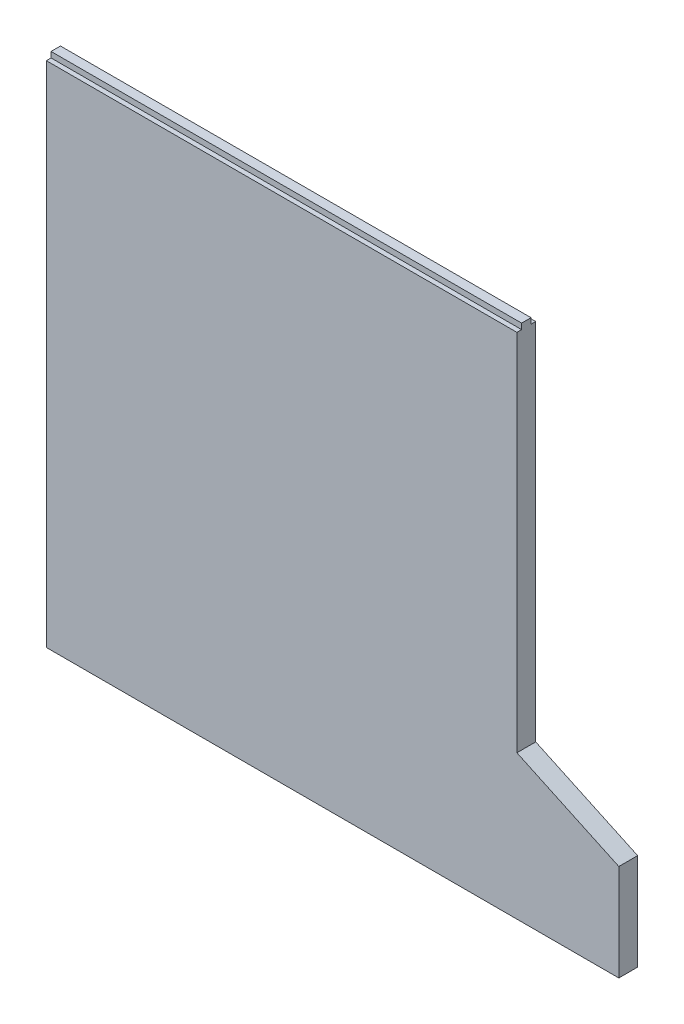
ISO-10303-21;
HEADER;
FILE_DESCRIPTION(('STEP AP214'),'2;1');
FILE_NAME('part.step','',(''),(''),'','','');
FILE_SCHEMA(('AUTOMOTIVE_DESIGN { 1 0 10303 214 1 1 1 1 }'));
ENDSEC;
DATA;
#1=APPLICATION_CONTEXT('core data for automotive mechanical design processes');
#2=APPLICATION_PROTOCOL_DEFINITION('international standard','automotive_design',2000,#1);
#3=PRODUCT_CONTEXT('',#1,'mechanical');
#4=PRODUCT('Part','Part','',(#3));
#5=PRODUCT_RELATED_PRODUCT_CATEGORY('part','',(#4));
#6=PRODUCT_DEFINITION_FORMATION('','',#4);
#7=PRODUCT_DEFINITION_CONTEXT('part definition',#1,'design');
#8=PRODUCT_DEFINITION('design','',#6,#7);
#9=PRODUCT_DEFINITION_SHAPE('','',#8);
#10=(LENGTH_UNIT() NAMED_UNIT(*) SI_UNIT(.MILLI.,.METRE.));
#11=(NAMED_UNIT(*) PLANE_ANGLE_UNIT() SI_UNIT($,.RADIAN.));
#12=(NAMED_UNIT(*) SI_UNIT($,.STERADIAN.) SOLID_ANGLE_UNIT());
#13=UNCERTAINTY_MEASURE_WITH_UNIT(LENGTH_MEASURE(1.E-05),#10,'distance_accuracy_value','');
#14=(GEOMETRIC_REPRESENTATION_CONTEXT(3) GLOBAL_UNCERTAINTY_ASSIGNED_CONTEXT((#13)) GLOBAL_UNIT_ASSIGNED_CONTEXT((#10,
#11,#12)) REPRESENTATION_CONTEXT('',''));
#15=CARTESIAN_POINT('',(0.,0.,0.));
#16=DIRECTION('',(0.,0.,1.));
#17=DIRECTION('',(1.,0.,0.));
#18=AXIS2_PLACEMENT_3D('',#15,#16,#17);
#19=CARTESIAN_POINT('',(0.,0.,10.));
#20=DIRECTION('',(1.,0.,0.));
#21=DIRECTION('',(0.,0.,-1.));
#22=AXIS2_PLACEMENT_3D('',#19,#20,#21);
#23=PLANE('',#22);
#24=DIRECTION('',(0.,0.,1.));
#25=VECTOR('',#24,1.);
#26=CARTESIAN_POINT('',(0.,270.,10.));
#27=LINE('',#26,#25);
#28=CARTESIAN_POINT('',(0.,270.,7.5));
#29=VERTEX_POINT('',#28);
#30=CARTESIAN_POINT('',(0.,270.,10.));
#31=VERTEX_POINT('',#30);
#32=EDGE_CURVE('E47',#29,#31,#27,.T.);
#33=ORIENTED_EDGE('',*,*,#32,.F.);
#34=DIRECTION('',(0.,-1.,0.));
#35=VECTOR('',#34,1.);
#36=CARTESIAN_POINT('',(0.,0.,7.50000000000086));
#37=LINE('',#36,#35);
#38=CARTESIAN_POINT('',(0.,273.,7.49999999999999));
#39=VERTEX_POINT('',#38);
#40=EDGE_CURVE('E51',#39,#29,#37,.T.);
#41=ORIENTED_EDGE('',*,*,#40,.F.);
#42=DIRECTION('',(0.,0.,1.));
#43=VECTOR('',#42,1.);
#44=CARTESIAN_POINT('',(0.,273.,10.));
#45=LINE('',#44,#43);
#46=CARTESIAN_POINT('',(0.,273.,2.49999999999999));
#47=VERTEX_POINT('',#46);
#48=EDGE_CURVE('E152',#47,#39,#45,.T.);
#49=ORIENTED_EDGE('',*,*,#48,.F.);
#50=DIRECTION('',(0.,1.,0.));
#51=VECTOR('',#50,1.);
#52=CARTESIAN_POINT('',(0.,0.,2.50000000000097));
#53=LINE('',#52,#51);
#54=CARTESIAN_POINT('',(0.,270.,2.5));
#55=VERTEX_POINT('',#54);
#56=EDGE_CURVE('E121',#55,#47,#53,.T.);
#57=ORIENTED_EDGE('',*,*,#56,.F.);
#58=DIRECTION('',(0.,0.,1.));
#59=VECTOR('',#58,1.);
#60=CARTESIAN_POINT('',(0.,270.,10.));
#61=LINE('',#60,#59);
#62=CARTESIAN_POINT('',(0.,270.,0.));
#63=VERTEX_POINT('',#62);
#64=EDGE_CURVE('E119',#63,#55,#61,.T.);
#65=ORIENTED_EDGE('',*,*,#64,.F.);
#66=DIRECTION('',(0.,-1.,0.));
#67=VECTOR('',#66,1.);
#68=CARTESIAN_POINT('',(0.,0.,0.));
#69=LINE('',#68,#67);
#70=CARTESIAN_POINT('',(0.,0.,0.));
#71=VERTEX_POINT('',#70);
#72=EDGE_CURVE('E107',#63,#71,#69,.T.);
#73=ORIENTED_EDGE('',*,*,#72,.T.);
#74=DIRECTION('',(0.,0.,-1.));
#75=VECTOR('',#74,1.);
#76=CARTESIAN_POINT('',(0.,0.,10.));
#77=LINE('',#76,#75);
#78=CARTESIAN_POINT('',(0.,0.,10.));
#79=VERTEX_POINT('',#78);
#80=EDGE_CURVE('E11',#79,#71,#77,.T.);
#81=ORIENTED_EDGE('',*,*,#80,.F.);
#82=DIRECTION('',(0.,-1.,0.));
#83=VECTOR('',#82,1.);
#84=CARTESIAN_POINT('',(0.,0.,10.));
#85=LINE('',#84,#83);
#86=EDGE_CURVE('E155',#31,#79,#85,.T.);
#87=ORIENTED_EDGE('',*,*,#86,.F.);
#88=EDGE_LOOP('',(#33,#41,#49,#57,#65,#73,#81,#87));
#89=FACE_BOUND('',#88,.T.);
#90=ADVANCED_FACE('F33',(#89),#23,.F.);
#91=CARTESIAN_POINT('',(250.,76.5587645760474,10.));
#92=DIRECTION('',(-1.,0.,0.));
#93=DIRECTION('',(0.,0.,1.));
#94=AXIS2_PLACEMENT_3D('',#91,#92,#93);
#95=PLANE('',#94);
#96=DIRECTION('',(0.,0.,-1.));
#97=VECTOR('',#96,1.);
#98=CARTESIAN_POINT('',(250.,270.,10.));
#99=LINE('',#98,#97);
#100=CARTESIAN_POINT('',(250.,270.,10.));
#101=VERTEX_POINT('',#100);
#102=CARTESIAN_POINT('',(250.,270.,7.5));
#103=VERTEX_POINT('',#102);
#104=EDGE_CURVE('E125',#101,#103,#99,.T.);
#105=ORIENTED_EDGE('',*,*,#104,.F.);
#106=DIRECTION('',(0.,1.,0.));
#107=VECTOR('',#106,1.);
#108=CARTESIAN_POINT('',(250.,76.5587645760474,10.));
#109=LINE('',#108,#107);
#110=CARTESIAN_POINT('',(250.,76.5587645760474,10.));
#111=VERTEX_POINT('',#110);
#112=EDGE_CURVE('E164',#111,#101,#109,.T.);
#113=ORIENTED_EDGE('',*,*,#112,.F.);
#114=DIRECTION('',(0.,0.,-1.));
#115=VECTOR('',#114,1.);
#116=CARTESIAN_POINT('',(250.,76.5587645760474,10.));
#117=LINE('',#116,#115);
#118=CARTESIAN_POINT('',(250.,76.5587645760474,0.));
#119=VERTEX_POINT('',#118);
#120=EDGE_CURVE('E166',#111,#119,#117,.T.);
#121=ORIENTED_EDGE('',*,*,#120,.T.);
#122=DIRECTION('',(0.,1.,0.));
#123=VECTOR('',#122,1.);
#124=CARTESIAN_POINT('',(250.,76.5587645760474,0.));
#125=LINE('',#124,#123);
#126=CARTESIAN_POINT('',(250.,270.,0.));
#127=VERTEX_POINT('',#126);
#128=EDGE_CURVE('E158',#119,#127,#125,.T.);
#129=ORIENTED_EDGE('',*,*,#128,.T.);
#130=DIRECTION('',(0.,0.,-1.));
#131=VECTOR('',#130,1.);
#132=CARTESIAN_POINT('',(250.,270.,0.));
#133=LINE('',#132,#131);
#134=CARTESIAN_POINT('',(250.,270.,2.5));
#135=VERTEX_POINT('',#134);
#136=EDGE_CURVE('E129',#135,#127,#133,.T.);
#137=ORIENTED_EDGE('',*,*,#136,.F.);
#138=DIRECTION('',(0.,-1.,0.));
#139=VECTOR('',#138,1.);
#140=CARTESIAN_POINT('',(250.,273.,2.49999999999999));
#141=LINE('',#140,#139);
#142=CARTESIAN_POINT('',(250.,273.,2.49999999999999));
#143=VERTEX_POINT('',#142);
#144=EDGE_CURVE('E139',#143,#135,#141,.T.);
#145=ORIENTED_EDGE('',*,*,#144,.F.);
#146=DIRECTION('',(0.,0.,-1.));
#147=VECTOR('',#146,1.);
#148=CARTESIAN_POINT('',(250.,273.,7.49999999999999));
#149=LINE('',#148,#147);
#150=CARTESIAN_POINT('',(250.,273.,7.49999999999999));
#151=VERTEX_POINT('',#150);
#152=EDGE_CURVE('E143',#151,#143,#149,.T.);
#153=ORIENTED_EDGE('',*,*,#152,.F.);
#154=DIRECTION('',(0.,1.,0.));
#155=VECTOR('',#154,1.);
#156=CARTESIAN_POINT('',(250.,273.,7.49999999999999));
#157=LINE('',#156,#155);
#158=EDGE_CURVE('E147',#103,#151,#157,.T.);
#159=ORIENTED_EDGE('',*,*,#158,.F.);
#160=EDGE_LOOP('',(#105,#113,#121,#129,#137,#145,#153,#159));
#161=FACE_BOUND('',#160,.T.);
#162=ADVANCED_FACE('F193',(#161),#95,.F.);
#163=CARTESIAN_POINT('',(0.,0.,10.));
#164=DIRECTION('',(0.,0.,-1.));
#165=DIRECTION('',(-1.,0.,0.));
#166=AXIS2_PLACEMENT_3D('',#163,#164,#165);
#167=PLANE('',#166);
#168=DIRECTION('',(-1.,0.,0.));
#169=VECTOR('',#168,1.);
#170=CARTESIAN_POINT('',(250.,270.,10.));
#171=LINE('',#170,#169);
#172=EDGE_CURVE('E148',#101,#31,#171,.T.);
#173=ORIENTED_EDGE('',*,*,#172,.T.);
#174=ORIENTED_EDGE('',*,*,#86,.T.);
#175=DIRECTION('',(1.,0.,0.));
#176=VECTOR('',#175,1.);
#177=CARTESIAN_POINT('',(0.,0.,10.));
#178=LINE('',#177,#176);
#179=CARTESIAN_POINT('',(304.147622093325,0.,10.));
#180=VERTEX_POINT('',#179);
#181=EDGE_CURVE('E157',#79,#180,#178,.T.);
#182=ORIENTED_EDGE('',*,*,#181,.T.);
#183=DIRECTION('',(0.,1.,0.));
#184=VECTOR('',#183,1.);
#185=CARTESIAN_POINT('',(304.147622093325,51.309313723047,10.));
#186=LINE('',#185,#184);
#187=CARTESIAN_POINT('',(304.147622093325,51.309313723047,10.));
#188=VERTEX_POINT('',#187);
#189=EDGE_CURVE('E160',#180,#188,#186,.T.);
#190=ORIENTED_EDGE('',*,*,#189,.T.);
#191=DIRECTION('',(-0.906307787036648,0.422618261740704,0.));
#192=VECTOR('',#191,1.);
#193=CARTESIAN_POINT('',(250.,76.5587645760474,10.));
#194=LINE('',#193,#192);
#195=EDGE_CURVE('E162',#188,#111,#194,.T.);
#196=ORIENTED_EDGE('',*,*,#195,.T.);
#197=ORIENTED_EDGE('',*,*,#112,.T.);
#198=EDGE_LOOP('',(#173,#174,#182,#190,#196,#197));
#199=FACE_BOUND('',#198,.T.);
#200=ADVANCED_FACE('F197',(#199),#167,.F.);
#201=CARTESIAN_POINT('',(304.147622093325,0.,10.));
#202=DIRECTION('',(0.,1.,0.));
#203=DIRECTION('',(0.,0.,1.));
#204=AXIS2_PLACEMENT_3D('',#201,#202,#203);
#205=PLANE('',#204);
#206=DIRECTION('',(1.,0.,0.));
#207=VECTOR('',#206,1.);
#208=CARTESIAN_POINT('',(304.147622093325,0.,0.));
#209=LINE('',#208,#207);
#210=CARTESIAN_POINT('',(304.147622093325,0.,0.));
#211=VERTEX_POINT('',#210);
#212=EDGE_CURVE('E115',#71,#211,#209,.T.);
#213=ORIENTED_EDGE('',*,*,#212,.T.);
#214=DIRECTION('',(0.,0.,-1.));
#215=VECTOR('',#214,1.);
#216=CARTESIAN_POINT('',(304.147622093325,0.,10.));
#217=LINE('',#216,#215);
#218=EDGE_CURVE('E40',#180,#211,#217,.T.);
#219=ORIENTED_EDGE('',*,*,#218,.F.);
#220=ORIENTED_EDGE('',*,*,#181,.F.);
#221=ORIENTED_EDGE('',*,*,#80,.T.);
#222=EDGE_LOOP('',(#213,#219,#220,#221));
#223=FACE_BOUND('',#222,.T.);
#224=ADVANCED_FACE('F232',(#223),#205,.F.);
#225=CARTESIAN_POINT('',(304.147622093325,51.309313723047,10.));
#226=DIRECTION('',(-1.,0.,0.));
#227=DIRECTION('',(0.,0.,1.));
#228=AXIS2_PLACEMENT_3D('',#225,#226,#227);
#229=PLANE('',#228);
#230=DIRECTION('',(0.,1.,0.));
#231=VECTOR('',#230,1.);
#232=CARTESIAN_POINT('',(304.147622093325,51.309313723047,0.));
#233=LINE('',#232,#231);
#234=CARTESIAN_POINT('',(304.147622093325,51.309313723047,0.));
#235=VERTEX_POINT('',#234);
#236=EDGE_CURVE('E169',#211,#235,#233,.T.);
#237=ORIENTED_EDGE('',*,*,#236,.T.);
#238=DIRECTION('',(0.,0.,-1.));
#239=VECTOR('',#238,1.);
#240=CARTESIAN_POINT('',(304.147622093325,51.309313723047,10.));
#241=LINE('',#240,#239);
#242=EDGE_CURVE('E176',#188,#235,#241,.T.);
#243=ORIENTED_EDGE('',*,*,#242,.F.);
#244=ORIENTED_EDGE('',*,*,#189,.F.);
#245=ORIENTED_EDGE('',*,*,#218,.T.);
#246=EDGE_LOOP('',(#237,#243,#244,#245));
#247=FACE_BOUND('',#246,.T.);
#248=ADVANCED_FACE('F182',(#247),#229,.F.);
#249=CARTESIAN_POINT('',(250.,76.5587645760474,10.));
#250=DIRECTION('',(-0.422618261740704,-0.906307787036648,0.));
#251=DIRECTION('',(0.906307787036648,-0.422618261740704,0.));
#252=AXIS2_PLACEMENT_3D('',#249,#250,#251);
#253=PLANE('',#252);
#254=DIRECTION('',(-0.906307787036648,0.422618261740704,0.));
#255=VECTOR('',#254,1.);
#256=CARTESIAN_POINT('',(250.,76.5587645760474,0.));
#257=LINE('',#256,#255);
#258=EDGE_CURVE('E171',#235,#119,#257,.T.);
#259=ORIENTED_EDGE('',*,*,#258,.T.);
#260=ORIENTED_EDGE('',*,*,#120,.F.);
#261=ORIENTED_EDGE('',*,*,#195,.F.);
#262=ORIENTED_EDGE('',*,*,#242,.T.);
#263=EDGE_LOOP('',(#259,#260,#261,#262));
#264=FACE_BOUND('',#263,.T.);
#265=ADVANCED_FACE('F189',(#264),#253,.F.);
#266=CARTESIAN_POINT('',(0.,0.,0.));
#267=DIRECTION('',(0.,0.,-1.));
#268=DIRECTION('',(-1.,0.,0.));
#269=AXIS2_PLACEMENT_3D('',#266,#267,#268);
#270=PLANE('',#269);
#271=DIRECTION('',(-1.,0.,0.));
#272=VECTOR('',#271,1.);
#273=CARTESIAN_POINT('',(250.,270.,0.));
#274=LINE('',#273,#272);
#275=EDGE_CURVE('E112',#127,#63,#274,.T.);
#276=ORIENTED_EDGE('',*,*,#275,.F.);
#277=ORIENTED_EDGE('',*,*,#128,.F.);
#278=ORIENTED_EDGE('',*,*,#258,.F.);
#279=ORIENTED_EDGE('',*,*,#236,.F.);
#280=ORIENTED_EDGE('',*,*,#212,.F.);
#281=ORIENTED_EDGE('',*,*,#72,.F.);
#282=EDGE_LOOP('',(#276,#277,#278,#279,#280,#281));
#283=FACE_BOUND('',#282,.T.);
#284=ADVANCED_FACE('F109',(#283),#270,.T.);
#285=CARTESIAN_POINT('',(250.,273.,7.49999999999999));
#286=DIRECTION('',(0.,0.,1.));
#287=DIRECTION('',(0.,-1.,0.));
#288=AXIS2_PLACEMENT_3D('',#285,#286,#287);
#289=PLANE('',#288);
#290=DIRECTION('',(-1.,0.,0.));
#291=VECTOR('',#290,1.);
#292=CARTESIAN_POINT('',(250.,273.,7.49999999999999));
#293=LINE('',#292,#291);
#294=EDGE_CURVE('E140',#151,#39,#293,.T.);
#295=ORIENTED_EDGE('',*,*,#294,.T.);
#296=ORIENTED_EDGE('',*,*,#40,.T.);
#297=DIRECTION('',(-1.,0.,0.));
#298=VECTOR('',#297,1.);
#299=CARTESIAN_POINT('',(250.,270.,7.5));
#300=LINE('',#299,#298);
#301=EDGE_CURVE('E144',#103,#29,#300,.T.);
#302=ORIENTED_EDGE('',*,*,#301,.F.);
#303=ORIENTED_EDGE('',*,*,#158,.T.);
#304=EDGE_LOOP('',(#295,#296,#302,#303));
#305=FACE_BOUND('',#304,.T.);
#306=ADVANCED_FACE('F203',(#305),#289,.T.);
#307=CARTESIAN_POINT('',(250.,273.,7.49999999999999));
#308=DIRECTION('',(0.,1.,0.));
#309=DIRECTION('',(0.,0.,1.));
#310=AXIS2_PLACEMENT_3D('',#307,#308,#309);
#311=PLANE('',#310);
#312=DIRECTION('',(-1.,0.,0.));
#313=VECTOR('',#312,1.);
#314=CARTESIAN_POINT('',(250.,273.,2.49999999999999));
#315=LINE('',#314,#313);
#316=EDGE_CURVE('E136',#143,#47,#315,.T.);
#317=ORIENTED_EDGE('',*,*,#316,.T.);
#318=ORIENTED_EDGE('',*,*,#48,.T.);
#319=ORIENTED_EDGE('',*,*,#294,.F.);
#320=ORIENTED_EDGE('',*,*,#152,.T.);
#321=EDGE_LOOP('',(#317,#318,#319,#320));
#322=FACE_BOUND('',#321,.T.);
#323=ADVANCED_FACE('F207',(#322),#311,.T.);
#324=CARTESIAN_POINT('',(250.,273.,2.49999999999999));
#325=DIRECTION('',(0.,0.,-1.));
#326=DIRECTION('',(0.,1.,0.));
#327=AXIS2_PLACEMENT_3D('',#324,#325,#326);
#328=PLANE('',#327);
#329=DIRECTION('',(-1.,0.,0.));
#330=VECTOR('',#329,1.);
#331=CARTESIAN_POINT('',(250.,270.,2.5));
#332=LINE('',#331,#330);
#333=EDGE_CURVE('E130',#135,#55,#332,.T.);
#334=ORIENTED_EDGE('',*,*,#333,.T.);
#335=ORIENTED_EDGE('',*,*,#56,.T.);
#336=ORIENTED_EDGE('',*,*,#316,.F.);
#337=ORIENTED_EDGE('',*,*,#144,.T.);
#338=EDGE_LOOP('',(#334,#335,#336,#337));
#339=FACE_BOUND('',#338,.T.);
#340=ADVANCED_FACE('F210',(#339),#328,.T.);
#341=CARTESIAN_POINT('',(250.,270.,10.));
#342=DIRECTION('',(0.,1.,0.));
#343=DIRECTION('',(0.,0.,1.));
#344=AXIS2_PLACEMENT_3D('',#341,#342,#343);
#345=PLANE('',#344);
#346=ORIENTED_EDGE('',*,*,#301,.T.);
#347=ORIENTED_EDGE('',*,*,#32,.T.);
#348=ORIENTED_EDGE('',*,*,#172,.F.);
#349=ORIENTED_EDGE('',*,*,#104,.T.);
#350=EDGE_LOOP('',(#346,#347,#348,#349));
#351=FACE_BOUND('',#350,.T.);
#352=ADVANCED_FACE('F199',(#351),#345,.T.);
#353=CARTESIAN_POINT('',(250.,270.,0.));
#354=DIRECTION('',(0.,1.,0.));
#355=DIRECTION('',(0.,0.,1.));
#356=AXIS2_PLACEMENT_3D('',#353,#354,#355);
#357=PLANE('',#356);
#358=ORIENTED_EDGE('',*,*,#275,.T.);
#359=ORIENTED_EDGE('',*,*,#64,.T.);
#360=ORIENTED_EDGE('',*,*,#333,.F.);
#361=ORIENTED_EDGE('',*,*,#136,.T.);
#362=EDGE_LOOP('',(#358,#359,#360,#361));
#363=FACE_BOUND('',#362,.T.);
#364=ADVANCED_FACE('F128',(#363),#357,.T.);
#365=CLOSED_SHELL('',(#90,#162,#200,#224,#248,#265,#284,#306,#323,#340,#352,#364));
#366=MANIFOLD_SOLID_BREP('B2',#365);
#367=ADVANCED_BREP_SHAPE_REPRESENTATION('',(#18,#366),#14);
#368=SHAPE_DEFINITION_REPRESENTATION(#9,#367);
ENDSEC;
END-ISO-10303-21;
